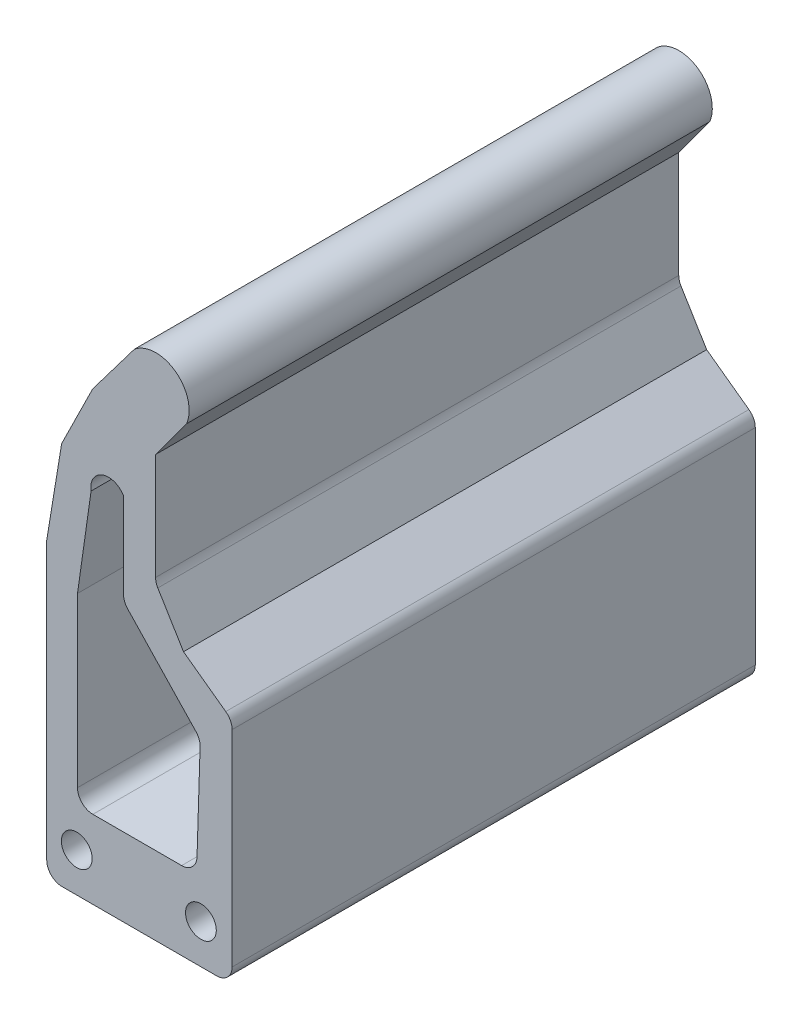
ISO-10303-21;
HEADER;
FILE_DESCRIPTION(('STEP AP214'),'2;1');
FILE_NAME('part.step','',(''),(''),'','','');
FILE_SCHEMA(('AUTOMOTIVE_DESIGN { 1 0 10303 214 1 1 1 1 }'));
ENDSEC;
DATA;
#1=APPLICATION_CONTEXT('core data for automotive mechanical design processes');
#2=APPLICATION_PROTOCOL_DEFINITION('international standard','automotive_design',2000,#1);
#3=PRODUCT_CONTEXT('',#1,'mechanical');
#4=PRODUCT('Part','Part','',(#3));
#5=PRODUCT_RELATED_PRODUCT_CATEGORY('part','',(#4));
#6=PRODUCT_DEFINITION_FORMATION('','',#4);
#7=PRODUCT_DEFINITION_CONTEXT('part definition',#1,'design');
#8=PRODUCT_DEFINITION('design','',#6,#7);
#9=PRODUCT_DEFINITION_SHAPE('','',#8);
#10=(LENGTH_UNIT() NAMED_UNIT(*) SI_UNIT(.MILLI.,.METRE.));
#11=(NAMED_UNIT(*) PLANE_ANGLE_UNIT() SI_UNIT($,.RADIAN.));
#12=(NAMED_UNIT(*) SI_UNIT($,.STERADIAN.) SOLID_ANGLE_UNIT());
#13=UNCERTAINTY_MEASURE_WITH_UNIT(LENGTH_MEASURE(1.E-05),#10,'distance_accuracy_value','');
#14=(GEOMETRIC_REPRESENTATION_CONTEXT(3) GLOBAL_UNCERTAINTY_ASSIGNED_CONTEXT((#13)) GLOBAL_UNIT_ASSIGNED_CONTEXT((#10,
#11,#12)) REPRESENTATION_CONTEXT('',''));
#15=CARTESIAN_POINT('',(0.,0.,0.));
#16=DIRECTION('',(0.,0.,1.));
#17=DIRECTION('',(1.,0.,0.));
#18=AXIS2_PLACEMENT_3D('',#15,#16,#17);
#19=CARTESIAN_POINT('',(-300.,367.,74.));
#20=DIRECTION('',(0.986834646515188,-0.161732434710062,0.));
#21=DIRECTION('',(0.161732434710062,0.986834646515188,0.));
#22=AXIS2_PLACEMENT_3D('',#19,#20,#21);
#23=PLANE('',#22);
#24=DIRECTION('',(-0.161732434710062,-0.986834646515188,0.));
#25=VECTOR('',#24,1.);
#26=CARTESIAN_POINT('',(-300.,367.,40.));
#27=LINE('',#26,#25);
#28=CARTESIAN_POINT('',(-299.02960539174,372.921007879091,40.));
#29=VERTEX_POINT('',#28);
#30=CARTESIAN_POINT('',(-300.,367.,40.));
#31=VERTEX_POINT('',#30);
#32=EDGE_CURVE('E287',#29,#31,#27,.T.);
#33=ORIENTED_EDGE('',*,*,#32,.T.);
#34=DIRECTION('',(0.,0.,-1.));
#35=VECTOR('',#34,1.);
#36=CARTESIAN_POINT('',(-300.,367.,74.));
#37=LINE('',#36,#35);
#38=CARTESIAN_POINT('',(-300.,367.,74.));
#39=VERTEX_POINT('',#38);
#40=EDGE_CURVE('E389',#39,#31,#37,.T.);
#41=ORIENTED_EDGE('',*,*,#40,.F.);
#42=DIRECTION('',(-0.161732434710062,-0.986834646515188,0.));
#43=VECTOR('',#42,1.);
#44=CARTESIAN_POINT('',(-300.,367.,74.));
#45=LINE('',#44,#43);
#46=CARTESIAN_POINT('',(-299.02960539174,372.921007879091,74.));
#47=VERTEX_POINT('',#46);
#48=EDGE_CURVE('E290',#47,#39,#45,.T.);
#49=ORIENTED_EDGE('',*,*,#48,.F.);
#50=DIRECTION('',(0.,0.,-1.));
#51=VECTOR('',#50,1.);
#52=CARTESIAN_POINT('',(-299.02960539174,372.921007879091,74.));
#53=LINE('',#52,#51);
#54=EDGE_CURVE('E329',#47,#29,#53,.T.);
#55=ORIENTED_EDGE('',*,*,#54,.T.);
#56=EDGE_LOOP('',(#33,#41,#49,#55));
#57=FACE_BOUND('',#56,.T.);
#58=ADVANCED_FACE('F39',(#57),#23,.F.);
#59=CARTESIAN_POINT('',(-300.,367.,74.));
#60=DIRECTION('',(1.,0.,0.));
#61=DIRECTION('',(0.,0.,-1.));
#62=AXIS2_PLACEMENT_3D('',#59,#60,#61);
#63=PLANE('',#62);
#64=DIRECTION('',(0.,-1.,0.));
#65=VECTOR('',#64,1.);
#66=CARTESIAN_POINT('',(-300.,367.,40.));
#67=LINE('',#66,#65);
#68=CARTESIAN_POINT('',(-300.,349.,40.));
#69=VERTEX_POINT('',#68);
#70=EDGE_CURVE('E333',#31,#69,#67,.T.);
#71=ORIENTED_EDGE('',*,*,#70,.T.);
#72=DIRECTION('',(0.,0.,-1.));
#73=VECTOR('',#72,1.);
#74=CARTESIAN_POINT('',(-300.,349.,74.));
#75=LINE('',#74,#73);
#76=CARTESIAN_POINT('',(-300.,349.,74.));
#77=VERTEX_POINT('',#76);
#78=EDGE_CURVE('E439',#69,#77,#75,.F.);
#79=ORIENTED_EDGE('',*,*,#78,.T.);
#80=DIRECTION('',(0.,-1.,0.));
#81=VECTOR('',#80,1.);
#82=CARTESIAN_POINT('',(-300.,367.,74.));
#83=LINE('',#82,#81);
#84=EDGE_CURVE('E294',#39,#77,#83,.T.);
#85=ORIENTED_EDGE('',*,*,#84,.F.);
#86=ORIENTED_EDGE('',*,*,#40,.T.);
#87=EDGE_LOOP('',(#71,#79,#85,#86));
#88=FACE_BOUND('',#87,.T.);
#89=ADVANCED_FACE('F530',(#88),#63,.F.);
#90=CARTESIAN_POINT('',(-300.,348.,74.));
#91=DIRECTION('',(0.,1.,0.));
#92=DIRECTION('',(0.,0.,1.));
#93=AXIS2_PLACEMENT_3D('',#90,#91,#92);
#94=PLANE('',#93);
#95=DIRECTION('',(1.,0.,0.));
#96=VECTOR('',#95,1.);
#97=CARTESIAN_POINT('',(-300.,348.,40.));
#98=LINE('',#97,#96);
#99=CARTESIAN_POINT('',(-299.,348.,40.));
#100=VERTEX_POINT('',#99);
#101=CARTESIAN_POINT('',(-288.951606439745,348.,40.));
#102=VERTEX_POINT('',#101);
#103=EDGE_CURVE('E337',#100,#102,#98,.T.);
#104=ORIENTED_EDGE('',*,*,#103,.T.);
#105=DIRECTION('',(0.,0.,-1.));
#106=VECTOR('',#105,1.);
#107=CARTESIAN_POINT('',(-288.951606439745,348.,74.));
#108=LINE('',#107,#106);
#109=CARTESIAN_POINT('',(-288.951606439745,348.,74.));
#110=VERTEX_POINT('',#109);
#111=EDGE_CURVE('E436',#102,#110,#108,.F.);
#112=ORIENTED_EDGE('',*,*,#111,.T.);
#113=DIRECTION('',(1.,0.,0.));
#114=VECTOR('',#113,1.);
#115=CARTESIAN_POINT('',(-300.,348.,74.));
#116=LINE('',#115,#114);
#117=CARTESIAN_POINT('',(-299.,348.,74.));
#118=VERTEX_POINT('',#117);
#119=EDGE_CURVE('E299',#118,#110,#116,.T.);
#120=ORIENTED_EDGE('',*,*,#119,.F.);
#121=DIRECTION('',(0.,0.,-1.));
#122=VECTOR('',#121,1.);
#123=CARTESIAN_POINT('',(-299.,348.,74.));
#124=LINE('',#123,#122);
#125=EDGE_CURVE('E432',#118,#100,#124,.T.);
#126=ORIENTED_EDGE('',*,*,#125,.T.);
#127=EDGE_LOOP('',(#104,#112,#120,#126));
#128=FACE_BOUND('',#127,.T.);
#129=ADVANCED_FACE('F536',(#128),#94,.F.);
#130=CARTESIAN_POINT('',(-287.951606439745,348.,74.));
#131=DIRECTION('',(-1.,0.,0.));
#132=DIRECTION('',(0.,0.,1.));
#133=AXIS2_PLACEMENT_3D('',#130,#131,#132);
#134=PLANE('',#133);
#135=DIRECTION('',(0.,1.,0.));
#136=VECTOR('',#135,1.);
#137=CARTESIAN_POINT('',(-287.951606439745,348.,40.));
#138=LINE('',#137,#136);
#139=CARTESIAN_POINT('',(-287.951606439745,349.,40.));
#140=VERTEX_POINT('',#139);
#141=CARTESIAN_POINT('',(-287.951606439745,362.362205386471,40.));
#142=VERTEX_POINT('',#141);
#143=EDGE_CURVE('E341',#140,#142,#138,.T.);
#144=ORIENTED_EDGE('',*,*,#143,.T.);
#145=DIRECTION('',(0.,0.,-1.));
#146=VECTOR('',#145,1.);
#147=CARTESIAN_POINT('',(-287.951606439745,362.362205386471,74.));
#148=LINE('',#147,#146);
#149=CARTESIAN_POINT('',(-287.951606439745,362.362205386471,74.));
#150=VERTEX_POINT('',#149);
#151=EDGE_CURVE('E417',#142,#150,#148,.F.);
#152=ORIENTED_EDGE('',*,*,#151,.T.);
#153=DIRECTION('',(0.,1.,0.));
#154=VECTOR('',#153,1.);
#155=CARTESIAN_POINT('',(-287.951606439745,348.,74.));
#156=LINE('',#155,#154);
#157=CARTESIAN_POINT('',(-287.951606439745,349.,74.));
#158=VERTEX_POINT('',#157);
#159=EDGE_CURVE('E303',#158,#150,#156,.T.);
#160=ORIENTED_EDGE('',*,*,#159,.F.);
#161=DIRECTION('',(0.,0.,-1.));
#162=VECTOR('',#161,1.);
#163=CARTESIAN_POINT('',(-287.951606439745,349.,74.));
#164=LINE('',#163,#162);
#165=EDGE_CURVE('E413',#158,#140,#164,.T.);
#166=ORIENTED_EDGE('',*,*,#165,.T.);
#167=EDGE_LOOP('',(#144,#152,#160,#166));
#168=FACE_BOUND('',#167,.T.);
#169=ADVANCED_FACE('F773',(#168),#134,.F.);
#170=CARTESIAN_POINT('',(-287.951606439745,362.871836257271,74.));
#171=DIRECTION('',(-0.587649831397212,-0.809115366099809,0.));
#172=DIRECTION('',(0.809115366099809,-0.587649831397212,0.));
#173=AXIS2_PLACEMENT_3D('',#170,#171,#172);
#174=PLANE('',#173);
#175=DIRECTION('',(-0.809115366099809,0.587649831397212,0.));
#176=VECTOR('',#175,1.);
#177=CARTESIAN_POINT('',(-287.951606439745,362.871836257271,74.));
#178=LINE('',#177,#176);
#179=CARTESIAN_POINT('',(-288.363956608348,363.171320752571,74.));
#180=VERTEX_POINT('',#179);
#181=CARTESIAN_POINT('',(-291.110931396484,365.166412353516,74.));
#182=VERTEX_POINT('',#181);
#183=EDGE_CURVE('E307',#180,#182,#178,.T.);
#184=ORIENTED_EDGE('',*,*,#183,.F.);
#185=DIRECTION('',(0.,0.,-1.));
#186=VECTOR('',#185,1.);
#187=CARTESIAN_POINT('',(-288.363956608348,363.171320752571,74.));
#188=LINE('',#187,#186);
#189=CARTESIAN_POINT('',(-288.363956608348,363.171320752571,40.));
#190=VERTEX_POINT('',#189);
#191=EDGE_CURVE('E400',#180,#190,#188,.T.);
#192=ORIENTED_EDGE('',*,*,#191,.T.);
#193=DIRECTION('',(-0.809115366099809,0.587649831397212,0.));
#194=VECTOR('',#193,1.);
#195=CARTESIAN_POINT('',(-287.951606439745,362.871836257271,40.));
#196=LINE('',#195,#194);
#197=CARTESIAN_POINT('',(-291.110931396484,365.166412353516,40.));
#198=VERTEX_POINT('',#197);
#199=EDGE_CURVE('E345',#190,#198,#196,.T.);
#200=ORIENTED_EDGE('',*,*,#199,.T.);
#201=DIRECTION('',(0.,0.,-1.));
#202=VECTOR('',#201,1.);
#203=CARTESIAN_POINT('',(-291.110931396484,365.166412353516,74.));
#204=LINE('',#203,#202);
#205=EDGE_CURVE('E385',#182,#198,#204,.T.);
#206=ORIENTED_EDGE('',*,*,#205,.F.);
#207=EDGE_LOOP('',(#184,#192,#200,#206));
#208=FACE_BOUND('',#207,.T.);
#209=ADVANCED_FACE('F764',(#208),#174,.F.);
#210=CARTESIAN_POINT('',(-291.110931396484,365.166412353516,74.));
#211=DIRECTION('',(-0.855055239305162,-0.518536920321776,0.));
#212=DIRECTION('',(0.518536920321776,-0.855055239305162,0.));
#213=AXIS2_PLACEMENT_3D('',#210,#211,#212);
#214=PLANE('',#213);
#215=DIRECTION('',(-0.518536920321776,0.855055239305162,0.));
#216=VECTOR('',#215,1.);
#217=CARTESIAN_POINT('',(-291.110931396484,365.166412353516,40.));
#218=LINE('',#217,#216);
#219=CARTESIAN_POINT('',(-292.780865856916,367.920095174793,40.));
#220=VERTEX_POINT('',#219);
#221=EDGE_CURVE('E348',#198,#220,#218,.T.);
#222=ORIENTED_EDGE('',*,*,#221,.T.);
#223=DIRECTION('',(0.,0.,-1.));
#224=VECTOR('',#223,1.);
#225=CARTESIAN_POINT('',(-292.780865856916,367.920095174793,74.));
#226=LINE('',#225,#224);
#227=CARTESIAN_POINT('',(-292.780865856916,367.920095174793,74.));
#228=VERTEX_POINT('',#227);
#229=EDGE_CURVE('E397',#220,#228,#226,.F.);
#230=ORIENTED_EDGE('',*,*,#229,.T.);
#231=DIRECTION('',(-0.518536920321776,0.855055239305162,0.));
#232=VECTOR('',#231,1.);
#233=CARTESIAN_POINT('',(-291.110931396484,365.166412353516,74.));
#234=LINE('',#233,#232);
#235=EDGE_CURVE('E310',#182,#228,#234,.T.);
#236=ORIENTED_EDGE('',*,*,#235,.F.);
#237=ORIENTED_EDGE('',*,*,#205,.T.);
#238=EDGE_LOOP('',(#222,#230,#236,#237));
#239=FACE_BOUND('',#238,.T.);
#240=ADVANCED_FACE('F755',(#239),#214,.F.);
#241=CARTESIAN_POINT('',(-292.925810617611,368.159105691084,74.));
#242=DIRECTION('',(-1.,0.,0.));
#243=DIRECTION('',(0.,0.,1.));
#244=AXIS2_PLACEMENT_3D('',#241,#242,#243);
#245=PLANE('',#244);
#246=DIRECTION('',(0.,1.,0.));
#247=VECTOR('',#246,1.);
#248=CARTESIAN_POINT('',(-292.925810617611,368.159105691084,74.));
#249=LINE('',#248,#247);
#250=CARTESIAN_POINT('',(-292.925810617611,368.438632095115,74.));
#251=VERTEX_POINT('',#250);
#252=CARTESIAN_POINT('',(-292.925810617611,375.359105691084,74.));
#253=VERTEX_POINT('',#252);
#254=EDGE_CURVE('E314',#251,#253,#249,.T.);
#255=ORIENTED_EDGE('',*,*,#254,.F.);
#256=DIRECTION('',(0.,0.,-1.));
#257=VECTOR('',#256,1.);
#258=CARTESIAN_POINT('',(-292.925810617611,368.438632095115,40.));
#259=LINE('',#258,#257);
#260=CARTESIAN_POINT('',(-292.925810617611,368.438632095115,40.));
#261=VERTEX_POINT('',#260);
#262=EDGE_CURVE('E393',#251,#261,#259,.T.);
#263=ORIENTED_EDGE('',*,*,#262,.T.);
#264=DIRECTION('',(0.,1.,0.));
#265=VECTOR('',#264,1.);
#266=CARTESIAN_POINT('',(-292.925810617611,368.159105691084,40.));
#267=LINE('',#266,#265);
#268=CARTESIAN_POINT('',(-292.925810617611,375.359105691084,40.));
#269=VERTEX_POINT('',#268);
#270=EDGE_CURVE('E352',#261,#269,#267,.T.);
#271=ORIENTED_EDGE('',*,*,#270,.T.);
#272=DIRECTION('',(0.,0.,-1.));
#273=VECTOR('',#272,1.);
#274=CARTESIAN_POINT('',(-292.925810617611,375.359105691084,74.));
#275=LINE('',#274,#273);
#276=EDGE_CURVE('E381',#253,#269,#275,.T.);
#277=ORIENTED_EDGE('',*,*,#276,.F.);
#278=EDGE_LOOP('',(#255,#263,#271,#277));
#279=FACE_BOUND('',#278,.T.);
#280=ADVANCED_FACE('F747',(#279),#245,.F.);
#281=CARTESIAN_POINT('',(-292.925810617611,375.359105691084,74.));
#282=DIRECTION('',(-0.805397111157276,0.592735601545507,0.));
#283=DIRECTION('',(-0.592735601545507,-0.805397111157276,0.));
#284=AXIS2_PLACEMENT_3D('',#281,#282,#283);
#285=PLANE('',#284);
#286=DIRECTION('',(0.592735601545507,0.805397111157276,0.));
#287=VECTOR('',#286,1.);
#288=CARTESIAN_POINT('',(-292.925810617611,375.359105691084,40.));
#289=LINE('',#288,#287);
#290=CARTESIAN_POINT('',(-290.910509572356,378.097455869018,40.));
#291=VERTEX_POINT('',#290);
#292=EDGE_CURVE('E355',#269,#291,#289,.T.);
#293=ORIENTED_EDGE('',*,*,#292,.T.);
#294=DIRECTION('',(0.,0.,-1.));
#295=VECTOR('',#294,1.);
#296=CARTESIAN_POINT('',(-290.910509572356,378.097455869018,74.));
#297=LINE('',#296,#295);
#298=CARTESIAN_POINT('',(-290.910509572356,378.097455869018,74.));
#299=VERTEX_POINT('',#298);
#300=EDGE_CURVE('E377',#299,#291,#297,.T.);
#301=ORIENTED_EDGE('',*,*,#300,.F.);
#302=DIRECTION('',(0.592735601545507,0.805397111157276,0.));
#303=VECTOR('',#302,1.);
#304=CARTESIAN_POINT('',(-292.925810617611,375.359105691084,74.));
#305=LINE('',#304,#303);
#306=EDGE_CURVE('E317',#253,#299,#305,.T.);
#307=ORIENTED_EDGE('',*,*,#306,.F.);
#308=ORIENTED_EDGE('',*,*,#276,.T.);
#309=EDGE_LOOP('',(#293,#301,#307,#308));
#310=FACE_BOUND('',#309,.T.);
#311=ADVANCED_FACE('F738',(#310),#285,.F.);
#312=CARTESIAN_POINT('',(-292.914695624546,378.929613057887,74.));
#313=DIRECTION('',(0.,0.,-1.));
#314=DIRECTION('',(-1.,0.,0.));
#315=AXIS2_PLACEMENT_3D('',#312,#313,#314);
#316=CYLINDRICAL_SURFACE('',#315,2.17008002589271);
#317=CARTESIAN_POINT('',(-292.914695624546,378.929613057887,40.));
#318=DIRECTION('',(0.,0.,1.));
#319=DIRECTION('',(-1.,0.,0.));
#320=AXIS2_PLACEMENT_3D('',#317,#318,#319);
#321=CIRCLE('',#320,2.17008002589271);
#322=CARTESIAN_POINT('',(-294.299987792969,380.600006103516,40.));
#323=VERTEX_POINT('',#322);
#324=EDGE_CURVE('E358',#291,#323,#321,.T.);
#325=ORIENTED_EDGE('',*,*,#324,.T.);
#326=DIRECTION('',(0.,0.,-1.));
#327=VECTOR('',#326,1.);
#328=CARTESIAN_POINT('',(-294.299987792969,380.600006103516,74.));
#329=LINE('',#328,#327);
#330=CARTESIAN_POINT('',(-294.299987792969,380.600006103516,74.));
#331=VERTEX_POINT('',#330);
#332=EDGE_CURVE('E373',#331,#323,#329,.T.);
#333=ORIENTED_EDGE('',*,*,#332,.F.);
#334=CARTESIAN_POINT('',(-292.914695624546,378.929613057887,74.));
#335=DIRECTION('',(0.,0.,1.));
#336=DIRECTION('',(-1.,0.,0.));
#337=AXIS2_PLACEMENT_3D('',#334,#335,#336);
#338=CIRCLE('',#337,2.17008002589271);
#339=EDGE_CURVE('E320',#299,#331,#338,.T.);
#340=ORIENTED_EDGE('',*,*,#339,.F.);
#341=ORIENTED_EDGE('',*,*,#300,.T.);
#342=EDGE_LOOP('',(#325,#333,#340,#341));
#343=FACE_BOUND('',#342,.T.);
#344=ADVANCED_FACE('F729',(#343),#316,.T.);
#345=CARTESIAN_POINT('',(-297.012375964007,377.009330622549,74.));
#346=DIRECTION('',(0.797927884659181,-0.602752926897352,0.));
#347=DIRECTION('',(0.602752926897352,0.797927884659181,0.));
#348=AXIS2_PLACEMENT_3D('',#345,#346,#347);
#349=PLANE('',#348);
#350=DIRECTION('',(-0.602752926897352,-0.797927884659181,0.));
#351=VECTOR('',#350,1.);
#352=CARTESIAN_POINT('',(-297.012375964007,377.009330622549,40.));
#353=LINE('',#352,#351);
#354=CARTESIAN_POINT('',(-297.012375964007,377.009330622549,40.));
#355=VERTEX_POINT('',#354);
#356=EDGE_CURVE('E361',#323,#355,#353,.T.);
#357=ORIENTED_EDGE('',*,*,#356,.T.);
#358=DIRECTION('',(0.,0.,-1.));
#359=VECTOR('',#358,1.);
#360=CARTESIAN_POINT('',(-297.012375964007,377.009330622549,74.));
#361=LINE('',#360,#359);
#362=CARTESIAN_POINT('',(-297.012375964007,377.009330622549,74.));
#363=VERTEX_POINT('',#362);
#364=EDGE_CURVE('E369',#363,#355,#361,.T.);
#365=ORIENTED_EDGE('',*,*,#364,.F.);
#366=DIRECTION('',(-0.602752926897352,-0.797927884659181,0.));
#367=VECTOR('',#366,1.);
#368=CARTESIAN_POINT('',(-297.012375964007,377.009330622549,74.));
#369=LINE('',#368,#367);
#370=EDGE_CURVE('E323',#331,#363,#369,.T.);
#371=ORIENTED_EDGE('',*,*,#370,.F.);
#372=ORIENTED_EDGE('',*,*,#332,.T.);
#373=EDGE_LOOP('',(#357,#365,#371,#372));
#374=FACE_BOUND('',#373,.T.);
#375=ADVANCED_FACE('F720',(#374),#349,.F.);
#376=CARTESIAN_POINT('',(-299.02960539174,372.921007879091,74.));
#377=DIRECTION('',(0.896777724669226,-0.442481313206655,0.));
#378=DIRECTION('',(0.442481313206655,0.896777724669226,0.));
#379=AXIS2_PLACEMENT_3D('',#376,#377,#378);
#380=PLANE('',#379);
#381=DIRECTION('',(-0.442481313206655,-0.896777724669226,0.));
#382=VECTOR('',#381,1.);
#383=CARTESIAN_POINT('',(-299.02960539174,372.921007879091,40.));
#384=LINE('',#383,#382);
#385=EDGE_CURVE('E295',#355,#29,#384,.T.);
#386=ORIENTED_EDGE('',*,*,#385,.T.);
#387=ORIENTED_EDGE('',*,*,#54,.F.);
#388=DIRECTION('',(-0.442481313206655,-0.896777724669226,0.));
#389=VECTOR('',#388,1.);
#390=CARTESIAN_POINT('',(-299.02960539174,372.921007879091,74.));
#391=LINE('',#390,#389);
#392=EDGE_CURVE('E326',#363,#47,#391,.T.);
#393=ORIENTED_EDGE('',*,*,#392,.F.);
#394=ORIENTED_EDGE('',*,*,#364,.T.);
#395=EDGE_LOOP('',(#386,#387,#393,#394));
#396=FACE_BOUND('',#395,.T.);
#397=ADVANCED_FACE('F711',(#396),#380,.F.);
#398=CARTESIAN_POINT('',(-292.914695624546,378.929613057887,74.));
#399=DIRECTION('',(0.,0.,-1.));
#400=DIRECTION('',(-1.,0.,0.));
#401=AXIS2_PLACEMENT_3D('',#398,#399,#400);
#402=PLANE('',#401);
#403=CARTESIAN_POINT('',(-298.046417961778,350.54605621625,74.));
#404=DIRECTION('',(0.,0.,1.));
#405=DIRECTION('',(1.,0.,0.));
#406=AXIS2_PLACEMENT_3D('',#403,#404,#405);
#407=CIRCLE('',#406,0.999999999999998);
#408=CARTESIAN_POINT('',(-297.046417961778,350.54605621625,74.));
#409=VERTEX_POINT('',#408);
#410=EDGE_CURVE('E869',#409,#409,#407,.T.);
#411=ORIENTED_EDGE('',*,*,#410,.F.);
#412=EDGE_LOOP('',(#411));
#413=FACE_BOUND('',#412,.T.);
#414=CARTESIAN_POINT('',(-289.979523898029,350.54605621625,74.));
#415=DIRECTION('',(0.,0.,1.));
#416=DIRECTION('',(1.,0.,0.));
#417=AXIS2_PLACEMENT_3D('',#414,#415,#416);
#418=CIRCLE('',#417,0.999999999999998);
#419=CARTESIAN_POINT('',(-288.979523898029,350.54605621625,74.));
#420=VERTEX_POINT('',#419);
#421=EDGE_CURVE('E248',#420,#420,#418,.T.);
#422=ORIENTED_EDGE('',*,*,#421,.F.);
#423=EDGE_LOOP('',(#422));
#424=FACE_BOUND('',#423,.T.);
#425=DIRECTION('',(0.,1.,0.));
#426=VECTOR('',#425,1.);
#427=CARTESIAN_POINT('',(-295.010009765625,366.046598155361,74.));
#428=LINE('',#427,#426);
#429=CARTESIAN_POINT('',(-295.010009765625,366.445117957466,74.));
#430=VERTEX_POINT('',#429);
#431=CARTESIAN_POINT('',(-295.010009765625,371.995180702691,74.));
#432=VERTEX_POINT('',#431);
#433=EDGE_CURVE('E242',#430,#432,#428,.T.);
#434=ORIENTED_EDGE('',*,*,#433,.F.);
#435=CARTESIAN_POINT('',(-294.010009765625,366.445117957466,74.));
#436=DIRECTION('',(0.,0.,-1.));
#437=DIRECTION('',(-1.,0.,0.));
#438=AXIS2_PLACEMENT_3D('',#435,#436,#437);
#439=CIRCLE('',#438,1.);
#440=CARTESIAN_POINT('',(-294.735906277084,365.757314021266,74.));
#441=VERTEX_POINT('',#440);
#442=EDGE_CURVE('E420',#430,#441,#439,.F.);
#443=ORIENTED_EDGE('',*,*,#442,.T.);
#444=DIRECTION('',(-0.687803936199452,0.725896511459134,0.));
#445=VECTOR('',#444,1.);
#446=CARTESIAN_POINT('',(-290.018829345703,360.778991699219,74.));
#447=LINE('',#446,#445);
#448=CARTESIAN_POINT('',(-290.305656331398,361.081703994614,74.));
#449=VERTEX_POINT('',#448);
#450=EDGE_CURVE('E245',#449,#441,#447,.T.);
#451=ORIENTED_EDGE('',*,*,#450,.F.);
#452=CARTESIAN_POINT('',(-291.031552842858,360.393900058414,74.));
#453=DIRECTION('',(0.,0.,-1.));
#454=DIRECTION('',(-1.,0.,0.));
#455=AXIS2_PLACEMENT_3D('',#452,#453,#454);
#456=CIRCLE('',#455,1.);
#457=CARTESIAN_POINT('',(-290.032055956022,360.362182977758,74.));
#458=VERTEX_POINT('',#457);
#459=EDGE_CURVE('E484',#449,#458,#456,.T.);
#460=ORIENTED_EDGE('',*,*,#459,.T.);
#461=DIRECTION('',(0.0317170806563282,0.999496886835892,0.));
#462=VECTOR('',#461,1.);
#463=CARTESIAN_POINT('',(-290.263445910318,353.07041670614,74.));
#464=LINE('',#463,#462);
#465=CARTESIAN_POINT('',(-290.232719343927,354.038699625483,74.));
#466=VERTEX_POINT('',#465);
#467=EDGE_CURVE('E277',#466,#458,#464,.T.);
#468=ORIENTED_EDGE('',*,*,#467,.F.);
#469=CARTESIAN_POINT('',(-291.232216230763,354.07041670614,74.));
#470=DIRECTION('',(0.,0.,-1.));
#471=DIRECTION('',(-1.,0.,0.));
#472=AXIS2_PLACEMENT_3D('',#469,#470,#471);
#473=CIRCLE('',#472,1.);
#474=CARTESIAN_POINT('',(-291.232216230763,353.07041670614,74.));
#475=VERTEX_POINT('',#474);
#476=EDGE_CURVE('E48',#466,#475,#473,.T.);
#477=ORIENTED_EDGE('',*,*,#476,.T.);
#478=DIRECTION('',(1.,0.,0.));
#479=VECTOR('',#478,1.);
#480=CARTESIAN_POINT('',(-298.,353.07041670614,74.));
#481=LINE('',#480,#479);
#482=CARTESIAN_POINT('',(-297.,353.07041670614,74.));
#483=VERTEX_POINT('',#482);
#484=EDGE_CURVE('E274',#483,#475,#481,.T.);
#485=ORIENTED_EDGE('',*,*,#484,.F.);
#486=CARTESIAN_POINT('',(-297.,354.07041670614,74.));
#487=DIRECTION('',(0.,0.,-1.));
#488=DIRECTION('',(-1.,0.,0.));
#489=AXIS2_PLACEMENT_3D('',#486,#487,#488);
#490=CIRCLE('',#489,1.);
#491=CARTESIAN_POINT('',(-298.,354.07041670614,74.));
#492=VERTEX_POINT('',#491);
#493=EDGE_CURVE('E11',#483,#492,#490,.T.);
#494=ORIENTED_EDGE('',*,*,#493,.T.);
#495=DIRECTION('',(0.,-1.,0.));
#496=VECTOR('',#495,1.);
#497=CARTESIAN_POINT('',(-298.,365.,74.));
#498=LINE('',#497,#496);
#499=CARTESIAN_POINT('',(-298.,365.,74.));
#500=VERTEX_POINT('',#499);
#501=EDGE_CURVE('E270',#500,#492,#498,.T.);
#502=ORIENTED_EDGE('',*,*,#501,.F.);
#503=DIRECTION('',(-0.140886164265566,-0.990025802046864,0.));
#504=VECTOR('',#503,1.);
#505=CARTESIAN_POINT('',(-297.116612997975,371.207677877785,74.));
#506=LINE('',#505,#504);
#507=CARTESIAN_POINT('',(-297.116612997975,371.207677877785,74.));
#508=VERTEX_POINT('',#507);
#509=EDGE_CURVE('E266',#508,#500,#506,.T.);
#510=ORIENTED_EDGE('',*,*,#509,.F.);
#511=CARTESIAN_POINT('',(-295.991386116136,371.409026174535,74.));
#512=DIRECTION('',(0.,0.,1.));
#513=DIRECTION('',(-1.,0.,0.));
#514=AXIS2_PLACEMENT_3D('',#511,#512,#513);
#515=CIRCLE('',#514,1.14309958980794);
#516=EDGE_CURVE('E222',#432,#508,#515,.T.);
#517=ORIENTED_EDGE('',*,*,#516,.F.);
#518=EDGE_LOOP('',(#434,#443,#451,#460,#468,#477,#485,#494,#502,#510,#517));
#519=FACE_BOUND('',#518,.T.);
#520=ORIENTED_EDGE('',*,*,#159,.T.);
#521=CARTESIAN_POINT('',(-288.951606439745,362.362205386471,74.));
#522=DIRECTION('',(0.,0.,-1.));
#523=DIRECTION('',(-1.,0.,0.));
#524=AXIS2_PLACEMENT_3D('',#521,#522,#523);
#525=CIRCLE('',#524,1.);
#526=EDGE_CURVE('E429',#150,#180,#525,.F.);
#527=ORIENTED_EDGE('',*,*,#526,.T.);
#528=ORIENTED_EDGE('',*,*,#183,.T.);
#529=ORIENTED_EDGE('',*,*,#235,.T.);
#530=CARTESIAN_POINT('',(-291.925810617611,368.438632095115,74.));
#531=DIRECTION('',(0.,0.,-1.));
#532=DIRECTION('',(-1.,0.,0.));
#533=AXIS2_PLACEMENT_3D('',#530,#531,#532);
#534=CIRCLE('',#533,1.);
#535=EDGE_CURVE('E481',#228,#251,#534,.T.);
#536=ORIENTED_EDGE('',*,*,#535,.T.);
#537=ORIENTED_EDGE('',*,*,#254,.T.);
#538=ORIENTED_EDGE('',*,*,#306,.T.);
#539=ORIENTED_EDGE('',*,*,#339,.T.);
#540=ORIENTED_EDGE('',*,*,#370,.T.);
#541=ORIENTED_EDGE('',*,*,#392,.T.);
#542=ORIENTED_EDGE('',*,*,#48,.T.);
#543=ORIENTED_EDGE('',*,*,#84,.T.);
#544=CARTESIAN_POINT('',(-299.,349.,74.));
#545=DIRECTION('',(0.,0.,-1.));
#546=DIRECTION('',(-1.,0.,0.));
#547=AXIS2_PLACEMENT_3D('',#544,#545,#546);
#548=CIRCLE('',#547,1.);
#549=EDGE_CURVE('E423',#77,#118,#548,.F.);
#550=ORIENTED_EDGE('',*,*,#549,.T.);
#551=ORIENTED_EDGE('',*,*,#119,.T.);
#552=CARTESIAN_POINT('',(-288.951606439745,349.,74.));
#553=DIRECTION('',(0.,0.,-1.));
#554=DIRECTION('',(-1.,0.,0.));
#555=AXIS2_PLACEMENT_3D('',#552,#553,#554);
#556=CIRCLE('',#555,1.);
#557=EDGE_CURVE('E426',#110,#158,#556,.F.);
#558=ORIENTED_EDGE('',*,*,#557,.T.);
#559=EDGE_LOOP('',(#520,#527,#528,#529,#536,#537,#538,#539,#540,#541,#542,#543,#550,#551,#558));
#560=FACE_BOUND('',#559,.T.);
#561=ADVANCED_FACE('F493',(#413,#424,#519,#560),#402,.F.);
#562=CARTESIAN_POINT('',(-292.914695624546,378.929613057887,40.));
#563=DIRECTION('',(0.,0.,-1.));
#564=DIRECTION('',(-1.,0.,0.));
#565=AXIS2_PLACEMENT_3D('',#562,#563,#564);
#566=PLANE('',#565);
#567=ORIENTED_EDGE('',*,*,#199,.F.);
#568=CARTESIAN_POINT('',(-288.951606439745,362.362205386471,40.));
#569=DIRECTION('',(0.,0.,-1.));
#570=DIRECTION('',(-1.,0.,0.));
#571=AXIS2_PLACEMENT_3D('',#568,#569,#570);
#572=CIRCLE('',#571,1.);
#573=EDGE_CURVE('E410',#190,#142,#572,.T.);
#574=ORIENTED_EDGE('',*,*,#573,.T.);
#575=ORIENTED_EDGE('',*,*,#143,.F.);
#576=CARTESIAN_POINT('',(-288.951606439745,349.,40.));
#577=DIRECTION('',(0.,0.,-1.));
#578=DIRECTION('',(-1.,0.,0.));
#579=AXIS2_PLACEMENT_3D('',#576,#577,#578);
#580=CIRCLE('',#579,1.);
#581=EDGE_CURVE('E407',#140,#102,#580,.T.);
#582=ORIENTED_EDGE('',*,*,#581,.T.);
#583=ORIENTED_EDGE('',*,*,#103,.F.);
#584=CARTESIAN_POINT('',(-299.,349.,40.));
#585=DIRECTION('',(0.,0.,-1.));
#586=DIRECTION('',(-1.,0.,0.));
#587=AXIS2_PLACEMENT_3D('',#584,#585,#586);
#588=CIRCLE('',#587,1.);
#589=EDGE_CURVE('E404',#100,#69,#588,.T.);
#590=ORIENTED_EDGE('',*,*,#589,.T.);
#591=ORIENTED_EDGE('',*,*,#70,.F.);
#592=ORIENTED_EDGE('',*,*,#32,.F.);
#593=ORIENTED_EDGE('',*,*,#385,.F.);
#594=ORIENTED_EDGE('',*,*,#356,.F.);
#595=ORIENTED_EDGE('',*,*,#324,.F.);
#596=ORIENTED_EDGE('',*,*,#292,.F.);
#597=ORIENTED_EDGE('',*,*,#270,.F.);
#598=CARTESIAN_POINT('',(-291.925810617611,368.438632095115,40.));
#599=DIRECTION('',(0.,0.,-1.));
#600=DIRECTION('',(-1.,0.,0.));
#601=AXIS2_PLACEMENT_3D('',#598,#599,#600);
#602=CIRCLE('',#601,1.);
#603=EDGE_CURVE('E478',#261,#220,#602,.F.);
#604=ORIENTED_EDGE('',*,*,#603,.T.);
#605=ORIENTED_EDGE('',*,*,#221,.F.);
#606=EDGE_LOOP('',(#567,#574,#575,#582,#583,#590,#591,#592,#593,#594,#595,#596,#597,#604,#605));
#607=FACE_BOUND('',#606,.T.);
#608=ADVANCED_FACE('F695',(#607),#566,.T.);
#609=CARTESIAN_POINT('',(-295.991386116136,371.409026174535,42.));
#610=DIRECTION('',(0.,0.,1.));
#611=DIRECTION('',(1.,0.,0.));
#612=AXIS2_PLACEMENT_3D('',#609,#610,#611);
#613=CYLINDRICAL_SURFACE('',#612,1.14309958980794);
#614=ORIENTED_EDGE('',*,*,#516,.T.);
#615=DIRECTION('',(0.,0.,1.));
#616=VECTOR('',#615,1.);
#617=CARTESIAN_POINT('',(-297.116612997975,371.207677877785,42.));
#618=LINE('',#617,#616);
#619=CARTESIAN_POINT('',(-297.116612997975,371.207677877785,42.));
#620=VERTEX_POINT('',#619);
#621=EDGE_CURVE('E215',#620,#508,#618,.T.);
#622=ORIENTED_EDGE('',*,*,#621,.F.);
#623=CARTESIAN_POINT('',(-295.991386116136,371.409026174535,42.));
#624=DIRECTION('',(0.,0.,1.));
#625=DIRECTION('',(-1.,0.,0.));
#626=AXIS2_PLACEMENT_3D('',#623,#624,#625);
#627=CIRCLE('',#626,1.14309958980794);
#628=CARTESIAN_POINT('',(-295.010009765625,371.995180702691,42.));
#629=VERTEX_POINT('',#628);
#630=EDGE_CURVE('E220',#629,#620,#627,.T.);
#631=ORIENTED_EDGE('',*,*,#630,.F.);
#632=DIRECTION('',(0.,0.,1.));
#633=VECTOR('',#632,1.);
#634=CARTESIAN_POINT('',(-295.010009765625,371.995180702691,42.));
#635=LINE('',#634,#633);
#636=EDGE_CURVE('E284',#629,#432,#635,.T.);
#637=ORIENTED_EDGE('',*,*,#636,.T.);
#638=EDGE_LOOP('',(#614,#622,#631,#637));
#639=FACE_BOUND('',#638,.T.);
#640=ADVANCED_FACE('F217',(#639),#613,.F.);
#641=CARTESIAN_POINT('',(-295.010009765625,366.046598155361,42.));
#642=DIRECTION('',(1.,0.,0.));
#643=DIRECTION('',(0.,0.,-1.));
#644=AXIS2_PLACEMENT_3D('',#641,#642,#643);
#645=PLANE('',#644);
#646=DIRECTION('',(0.,1.,0.));
#647=VECTOR('',#646,1.);
#648=CARTESIAN_POINT('',(-295.010009765625,366.046598155361,42.));
#649=LINE('',#648,#647);
#650=CARTESIAN_POINT('',(-295.010009765625,366.445117957466,42.));
#651=VERTEX_POINT('',#650);
#652=EDGE_CURVE('E228',#651,#629,#649,.T.);
#653=ORIENTED_EDGE('',*,*,#652,.F.);
#654=DIRECTION('',(0.,0.,1.));
#655=VECTOR('',#654,1.);
#656=CARTESIAN_POINT('',(-295.010009765625,366.445117957466,42.));
#657=LINE('',#656,#655);
#658=EDGE_CURVE('E465',#651,#430,#657,.T.);
#659=ORIENTED_EDGE('',*,*,#658,.T.);
#660=ORIENTED_EDGE('',*,*,#433,.T.);
#661=ORIENTED_EDGE('',*,*,#636,.F.);
#662=EDGE_LOOP('',(#653,#659,#660,#661));
#663=FACE_BOUND('',#662,.T.);
#664=ADVANCED_FACE('F518',(#663),#645,.F.);
#665=CARTESIAN_POINT('',(-290.018829345703,360.778991699219,42.));
#666=DIRECTION('',(0.725896511459134,0.687803936199452,0.));
#667=DIRECTION('',(-0.687803936199452,0.725896511459134,0.));
#668=AXIS2_PLACEMENT_3D('',#665,#666,#667);
#669=PLANE('',#668);
#670=DIRECTION('',(-0.687803936199452,0.725896511459134,0.));
#671=VECTOR('',#670,1.);
#672=CARTESIAN_POINT('',(-290.018829345703,360.778991699219,42.));
#673=LINE('',#672,#671);
#674=CARTESIAN_POINT('',(-290.305656331398,361.081703994614,42.));
#675=VERTEX_POINT('',#674);
#676=CARTESIAN_POINT('',(-294.735906277084,365.757314021266,42.));
#677=VERTEX_POINT('',#676);
#678=EDGE_CURVE('E259',#675,#677,#673,.T.);
#679=ORIENTED_EDGE('',*,*,#678,.F.);
#680=DIRECTION('',(0.,0.,1.));
#681=VECTOR('',#680,1.);
#682=CARTESIAN_POINT('',(-290.305656331398,361.081703994614,74.));
#683=LINE('',#682,#681);
#684=EDGE_CURVE('E445',#675,#449,#683,.T.);
#685=ORIENTED_EDGE('',*,*,#684,.T.);
#686=ORIENTED_EDGE('',*,*,#450,.T.);
#687=DIRECTION('',(0.,0.,1.));
#688=VECTOR('',#687,1.);
#689=CARTESIAN_POINT('',(-294.735906277084,365.757314021266,42.));
#690=LINE('',#689,#688);
#691=EDGE_CURVE('E442',#441,#677,#690,.F.);
#692=ORIENTED_EDGE('',*,*,#691,.T.);
#693=EDGE_LOOP('',(#679,#685,#686,#692));
#694=FACE_BOUND('',#693,.T.);
#695=ADVANCED_FACE('F511',(#694),#669,.F.);
#696=CARTESIAN_POINT('',(-290.263445910318,353.07041670614,42.));
#697=DIRECTION('',(0.999496886835892,-0.0317170806563282,0.));
#698=DIRECTION('',(0.0317170806563282,0.999496886835892,0.));
#699=AXIS2_PLACEMENT_3D('',#696,#697,#698);
#700=PLANE('',#699);
#701=ORIENTED_EDGE('',*,*,#467,.T.);
#702=DIRECTION('',(0.,0.,1.));
#703=VECTOR('',#702,1.);
#704=CARTESIAN_POINT('',(-290.032055956022,360.362182977758,42.));
#705=LINE('',#704,#703);
#706=CARTESIAN_POINT('',(-290.032055956022,360.362182977758,42.));
#707=VERTEX_POINT('',#706);
#708=EDGE_CURVE('E453',#458,#707,#705,.F.);
#709=ORIENTED_EDGE('',*,*,#708,.T.);
#710=DIRECTION('',(0.0317170806563282,0.999496886835892,0.));
#711=VECTOR('',#710,1.);
#712=CARTESIAN_POINT('',(-290.263445910318,353.07041670614,42.));
#713=LINE('',#712,#711);
#714=CARTESIAN_POINT('',(-290.232719343927,354.038699625483,42.));
#715=VERTEX_POINT('',#714);
#716=EDGE_CURVE('E256',#715,#707,#713,.T.);
#717=ORIENTED_EDGE('',*,*,#716,.F.);
#718=DIRECTION('',(0.,0.,1.));
#719=VECTOR('',#718,1.);
#720=CARTESIAN_POINT('',(-290.232719343927,354.038699625483,74.));
#721=LINE('',#720,#719);
#722=EDGE_CURVE('E449',#715,#466,#721,.T.);
#723=ORIENTED_EDGE('',*,*,#722,.T.);
#724=EDGE_LOOP('',(#701,#709,#717,#723));
#725=FACE_BOUND('',#724,.T.);
#726=ADVANCED_FACE('F504',(#725),#700,.F.);
#727=CARTESIAN_POINT('',(-298.,353.07041670614,42.));
#728=DIRECTION('',(0.,-1.,0.));
#729=DIRECTION('',(0.,0.,-1.));
#730=AXIS2_PLACEMENT_3D('',#727,#728,#729);
#731=PLANE('',#730);
#732=ORIENTED_EDGE('',*,*,#484,.T.);
#733=DIRECTION('',(0.,0.,1.));
#734=VECTOR('',#733,1.);
#735=CARTESIAN_POINT('',(-291.232216230763,353.07041670614,42.));
#736=LINE('',#735,#734);
#737=CARTESIAN_POINT('',(-291.232216230763,353.07041670614,42.));
#738=VERTEX_POINT('',#737);
#739=EDGE_CURVE('E63',#475,#738,#736,.F.);
#740=ORIENTED_EDGE('',*,*,#739,.T.);
#741=DIRECTION('',(1.,0.,0.));
#742=VECTOR('',#741,1.);
#743=CARTESIAN_POINT('',(-298.,353.07041670614,42.));
#744=LINE('',#743,#742);
#745=CARTESIAN_POINT('',(-297.,353.07041670614,42.));
#746=VERTEX_POINT('',#745);
#747=EDGE_CURVE('E253',#746,#738,#744,.T.);
#748=ORIENTED_EDGE('',*,*,#747,.F.);
#749=DIRECTION('',(0.,0.,1.));
#750=VECTOR('',#749,1.);
#751=CARTESIAN_POINT('',(-297.,353.07041670614,74.));
#752=LINE('',#751,#750);
#753=EDGE_CURVE('E469',#746,#483,#752,.T.);
#754=ORIENTED_EDGE('',*,*,#753,.T.);
#755=EDGE_LOOP('',(#732,#740,#748,#754));
#756=FACE_BOUND('',#755,.T.);
#757=ADVANCED_FACE('F497',(#756),#731,.F.);
#758=CARTESIAN_POINT('',(-298.,365.,42.));
#759=DIRECTION('',(-1.,0.,0.));
#760=DIRECTION('',(0.,0.,1.));
#761=AXIS2_PLACEMENT_3D('',#758,#759,#760);
#762=PLANE('',#761);
#763=ORIENTED_EDGE('',*,*,#501,.T.);
#764=DIRECTION('',(0.,0.,1.));
#765=VECTOR('',#764,1.);
#766=CARTESIAN_POINT('',(-298.,354.07041670614,42.));
#767=LINE('',#766,#765);
#768=CARTESIAN_POINT('',(-298.,354.07041670614,42.));
#769=VERTEX_POINT('',#768);
#770=EDGE_CURVE('E475',#492,#769,#767,.F.);
#771=ORIENTED_EDGE('',*,*,#770,.T.);
#772=DIRECTION('',(0.,-1.,0.));
#773=VECTOR('',#772,1.);
#774=CARTESIAN_POINT('',(-298.,365.,42.));
#775=LINE('',#774,#773);
#776=CARTESIAN_POINT('',(-298.,365.,42.));
#777=VERTEX_POINT('',#776);
#778=EDGE_CURVE('E236',#777,#769,#775,.T.);
#779=ORIENTED_EDGE('',*,*,#778,.F.);
#780=DIRECTION('',(0.,0.,1.));
#781=VECTOR('',#780,1.);
#782=CARTESIAN_POINT('',(-298.,365.,42.));
#783=LINE('',#782,#781);
#784=EDGE_CURVE('E227',#777,#500,#783,.T.);
#785=ORIENTED_EDGE('',*,*,#784,.T.);
#786=EDGE_LOOP('',(#763,#771,#779,#785));
#787=FACE_BOUND('',#786,.T.);
#788=ADVANCED_FACE('F522',(#787),#762,.F.);
#789=CARTESIAN_POINT('',(-297.116612997975,371.207677877785,42.));
#790=DIRECTION('',(-0.990025802046864,0.140886164265566,0.));
#791=DIRECTION('',(-0.140886164265566,-0.990025802046864,0.));
#792=AXIS2_PLACEMENT_3D('',#789,#790,#791);
#793=PLANE('',#792);
#794=ORIENTED_EDGE('',*,*,#509,.T.);
#795=ORIENTED_EDGE('',*,*,#784,.F.);
#796=DIRECTION('',(-0.140886164265566,-0.990025802046864,0.));
#797=VECTOR('',#796,1.);
#798=CARTESIAN_POINT('',(-297.116612997975,371.207677877785,42.));
#799=LINE('',#798,#797);
#800=EDGE_CURVE('E231',#620,#777,#799,.T.);
#801=ORIENTED_EDGE('',*,*,#800,.F.);
#802=ORIENTED_EDGE('',*,*,#621,.T.);
#803=EDGE_LOOP('',(#794,#795,#801,#802));
#804=FACE_BOUND('',#803,.T.);
#805=ADVANCED_FACE('F232',(#804),#793,.F.);
#806=CARTESIAN_POINT('',(-295.991386116136,371.409026174535,42.));
#807=DIRECTION('',(0.,0.,-1.));
#808=DIRECTION('',(-1.,0.,0.));
#809=AXIS2_PLACEMENT_3D('',#806,#807,#808);
#810=PLANE('',#809);
#811=ORIENTED_EDGE('',*,*,#716,.T.);
#812=CARTESIAN_POINT('',(-291.031552842858,360.393900058414,42.));
#813=DIRECTION('',(0.,0.,-1.));
#814=DIRECTION('',(-1.,0.,0.));
#815=AXIS2_PLACEMENT_3D('',#812,#813,#814);
#816=CIRCLE('',#815,1.);
#817=EDGE_CURVE('E462',#707,#675,#816,.F.);
#818=ORIENTED_EDGE('',*,*,#817,.T.);
#819=ORIENTED_EDGE('',*,*,#678,.T.);
#820=CARTESIAN_POINT('',(-294.010009765625,366.445117957466,42.));
#821=DIRECTION('',(0.,0.,-1.));
#822=DIRECTION('',(-1.,0.,0.));
#823=AXIS2_PLACEMENT_3D('',#820,#821,#822);
#824=CIRCLE('',#823,1.);
#825=EDGE_CURVE('E55',#677,#651,#824,.T.);
#826=ORIENTED_EDGE('',*,*,#825,.T.);
#827=ORIENTED_EDGE('',*,*,#652,.T.);
#828=ORIENTED_EDGE('',*,*,#630,.T.);
#829=ORIENTED_EDGE('',*,*,#800,.T.);
#830=ORIENTED_EDGE('',*,*,#778,.T.);
#831=CARTESIAN_POINT('',(-297.,354.07041670614,42.));
#832=DIRECTION('',(0.,0.,-1.));
#833=DIRECTION('',(-1.,0.,0.));
#834=AXIS2_PLACEMENT_3D('',#831,#832,#833);
#835=CIRCLE('',#834,1.);
#836=EDGE_CURVE('E456',#769,#746,#835,.F.);
#837=ORIENTED_EDGE('',*,*,#836,.T.);
#838=ORIENTED_EDGE('',*,*,#747,.T.);
#839=CARTESIAN_POINT('',(-291.232216230763,354.07041670614,42.));
#840=DIRECTION('',(0.,0.,-1.));
#841=DIRECTION('',(-1.,0.,0.));
#842=AXIS2_PLACEMENT_3D('',#839,#840,#841);
#843=CIRCLE('',#842,1.);
#844=EDGE_CURVE('E459',#738,#715,#843,.F.);
#845=ORIENTED_EDGE('',*,*,#844,.T.);
#846=EDGE_LOOP('',(#811,#818,#819,#826,#827,#828,#829,#830,#837,#838,#845));
#847=FACE_BOUND('',#846,.T.);
#848=ADVANCED_FACE('F239',(#847),#810,.F.);
#849=CARTESIAN_POINT('',(-289.979523898029,350.54605621625,42.));
#850=DIRECTION('',(0.,0.,1.));
#851=DIRECTION('',(1.,0.,0.));
#852=AXIS2_PLACEMENT_3D('',#849,#850,#851);
#853=CYLINDRICAL_SURFACE('',#852,0.999999999999998);
#854=CARTESIAN_POINT('',(-289.979523898029,350.54605621625,42.));
#855=DIRECTION('',(0.,0.,1.));
#856=DIRECTION('',(1.,0.,0.));
#857=AXIS2_PLACEMENT_3D('',#854,#855,#856);
#858=CIRCLE('',#857,0.999999999999998);
#859=CARTESIAN_POINT('',(-288.979523898029,350.54605621625,42.));
#860=VERTEX_POINT('',#859);
#861=EDGE_CURVE('E874',#860,#860,#858,.T.);
#862=ORIENTED_EDGE('',*,*,#861,.F.);
#863=EDGE_LOOP('',(#862));
#864=FACE_BOUND('',#863,.T.);
#865=ORIENTED_EDGE('',*,*,#421,.T.);
#866=EDGE_LOOP('',(#865));
#867=FACE_BOUND('',#866,.T.);
#868=ADVANCED_FACE('F629',(#864,#867),#853,.F.);
#869=CARTESIAN_POINT('',(-289.979523898029,350.54605621625,42.));
#870=DIRECTION('',(0.,0.,1.));
#871=DIRECTION('',(1.,0.,0.));
#872=AXIS2_PLACEMENT_3D('',#869,#870,#871);
#873=PLANE('',#872);
#874=ORIENTED_EDGE('',*,*,#861,.T.);
#875=EDGE_LOOP('',(#874));
#876=FACE_BOUND('',#875,.T.);
#877=ADVANCED_FACE('F620',(#876),#873,.T.);
#878=CARTESIAN_POINT('',(-298.046417961778,350.54605621625,42.));
#879=DIRECTION('',(0.,0.,1.));
#880=DIRECTION('',(1.,0.,0.));
#881=AXIS2_PLACEMENT_3D('',#878,#879,#880);
#882=CYLINDRICAL_SURFACE('',#881,0.999999999999998);
#883=CARTESIAN_POINT('',(-298.046417961778,350.54605621625,42.));
#884=DIRECTION('',(0.,0.,1.));
#885=DIRECTION('',(1.,0.,0.));
#886=AXIS2_PLACEMENT_3D('',#883,#884,#885);
#887=CIRCLE('',#886,0.999999999999998);
#888=CARTESIAN_POINT('',(-297.046417961778,350.54605621625,42.));
#889=VERTEX_POINT('',#888);
#890=EDGE_CURVE('E267',#889,#889,#887,.T.);
#891=ORIENTED_EDGE('',*,*,#890,.F.);
#892=EDGE_LOOP('',(#891));
#893=FACE_BOUND('',#892,.T.);
#894=ORIENTED_EDGE('',*,*,#410,.T.);
#895=EDGE_LOOP('',(#894));
#896=FACE_BOUND('',#895,.T.);
#897=ADVANCED_FACE('F610',(#893,#896),#882,.F.);
#898=CARTESIAN_POINT('',(-298.046417961778,350.54605621625,42.));
#899=DIRECTION('',(0.,0.,1.));
#900=DIRECTION('',(1.,0.,0.));
#901=AXIS2_PLACEMENT_3D('',#898,#899,#900);
#902=PLANE('',#901);
#903=ORIENTED_EDGE('',*,*,#890,.T.);
#904=EDGE_LOOP('',(#903));
#905=FACE_BOUND('',#904,.T.);
#906=ADVANCED_FACE('F545',(#905),#902,.T.);
#907=CARTESIAN_POINT('',(-291.925810617611,368.438632095115,74.));
#908=DIRECTION('',(0.,0.,1.));
#909=DIRECTION('',(1.,0.,0.));
#910=AXIS2_PLACEMENT_3D('',#907,#908,#909);
#911=CYLINDRICAL_SURFACE('',#910,1.);
#912=ORIENTED_EDGE('',*,*,#535,.F.);
#913=ORIENTED_EDGE('',*,*,#229,.F.);
#914=ORIENTED_EDGE('',*,*,#603,.F.);
#915=ORIENTED_EDGE('',*,*,#262,.F.);
#916=EDGE_LOOP('',(#912,#913,#914,#915));
#917=FACE_BOUND('',#916,.T.);
#918=ADVANCED_FACE('F541',(#917),#911,.F.);
#919=CARTESIAN_POINT('',(-288.951606439745,362.362205386471,74.));
#920=DIRECTION('',(0.,0.,-1.));
#921=DIRECTION('',(-1.,0.,0.));
#922=AXIS2_PLACEMENT_3D('',#919,#920,#921);
#923=CYLINDRICAL_SURFACE('',#922,1.);
#924=ORIENTED_EDGE('',*,*,#526,.F.);
#925=ORIENTED_EDGE('',*,*,#151,.F.);
#926=ORIENTED_EDGE('',*,*,#573,.F.);
#927=ORIENTED_EDGE('',*,*,#191,.F.);
#928=EDGE_LOOP('',(#924,#925,#926,#927));
#929=FACE_BOUND('',#928,.T.);
#930=ADVANCED_FACE('F544',(#929),#923,.T.);
#931=CARTESIAN_POINT('',(-288.951606439745,349.,74.));
#932=DIRECTION('',(0.,0.,-1.));
#933=DIRECTION('',(-1.,0.,0.));
#934=AXIS2_PLACEMENT_3D('',#931,#932,#933);
#935=CYLINDRICAL_SURFACE('',#934,1.);
#936=ORIENTED_EDGE('',*,*,#557,.F.);
#937=ORIENTED_EDGE('',*,*,#111,.F.);
#938=ORIENTED_EDGE('',*,*,#581,.F.);
#939=ORIENTED_EDGE('',*,*,#165,.F.);
#940=EDGE_LOOP('',(#936,#937,#938,#939));
#941=FACE_BOUND('',#940,.T.);
#942=ADVANCED_FACE('F549',(#941),#935,.T.);
#943=CARTESIAN_POINT('',(-299.,349.,74.));
#944=DIRECTION('',(0.,0.,-1.));
#945=DIRECTION('',(-1.,0.,0.));
#946=AXIS2_PLACEMENT_3D('',#943,#944,#945);
#947=CYLINDRICAL_SURFACE('',#946,1.);
#948=ORIENTED_EDGE('',*,*,#549,.F.);
#949=ORIENTED_EDGE('',*,*,#78,.F.);
#950=ORIENTED_EDGE('',*,*,#589,.F.);
#951=ORIENTED_EDGE('',*,*,#125,.F.);
#952=EDGE_LOOP('',(#948,#949,#950,#951));
#953=FACE_BOUND('',#952,.T.);
#954=ADVANCED_FACE('F553',(#953),#947,.T.);
#955=CARTESIAN_POINT('',(-291.031552842858,360.393900058414,42.));
#956=DIRECTION('',(0.,0.,-1.));
#957=DIRECTION('',(-1.,0.,0.));
#958=AXIS2_PLACEMENT_3D('',#955,#956,#957);
#959=CYLINDRICAL_SURFACE('',#958,1.);
#960=ORIENTED_EDGE('',*,*,#817,.F.);
#961=ORIENTED_EDGE('',*,*,#708,.F.);
#962=ORIENTED_EDGE('',*,*,#459,.F.);
#963=ORIENTED_EDGE('',*,*,#684,.F.);
#964=EDGE_LOOP('',(#960,#961,#962,#963));
#965=FACE_BOUND('',#964,.T.);
#966=ADVANCED_FACE('F507',(#965),#959,.F.);
#967=CARTESIAN_POINT('',(-294.010009765625,366.445117957466,42.));
#968=DIRECTION('',(0.,0.,1.));
#969=DIRECTION('',(1.,0.,0.));
#970=AXIS2_PLACEMENT_3D('',#967,#968,#969);
#971=CYLINDRICAL_SURFACE('',#970,1.);
#972=ORIENTED_EDGE('',*,*,#825,.F.);
#973=ORIENTED_EDGE('',*,*,#691,.F.);
#974=ORIENTED_EDGE('',*,*,#442,.F.);
#975=ORIENTED_EDGE('',*,*,#658,.F.);
#976=EDGE_LOOP('',(#972,#973,#974,#975));
#977=FACE_BOUND('',#976,.T.);
#978=ADVANCED_FACE('F515',(#977),#971,.T.);
#979=CARTESIAN_POINT('',(-291.232216230763,354.07041670614,42.));
#980=DIRECTION('',(0.,0.,-1.));
#981=DIRECTION('',(-1.,0.,0.));
#982=AXIS2_PLACEMENT_3D('',#979,#980,#981);
#983=CYLINDRICAL_SURFACE('',#982,1.);
#984=ORIENTED_EDGE('',*,*,#844,.F.);
#985=ORIENTED_EDGE('',*,*,#739,.F.);
#986=ORIENTED_EDGE('',*,*,#476,.F.);
#987=ORIENTED_EDGE('',*,*,#722,.F.);
#988=EDGE_LOOP('',(#984,#985,#986,#987));
#989=FACE_BOUND('',#988,.T.);
#990=ADVANCED_FACE('F500',(#989),#983,.F.);
#991=CARTESIAN_POINT('',(-297.,354.07041670614,42.));
#992=DIRECTION('',(0.,0.,-1.));
#993=DIRECTION('',(-1.,0.,0.));
#994=AXIS2_PLACEMENT_3D('',#991,#992,#993);
#995=CYLINDRICAL_SURFACE('',#994,1.);
#996=ORIENTED_EDGE('',*,*,#836,.F.);
#997=ORIENTED_EDGE('',*,*,#770,.F.);
#998=ORIENTED_EDGE('',*,*,#493,.F.);
#999=ORIENTED_EDGE('',*,*,#753,.F.);
#1000=EDGE_LOOP('',(#996,#997,#998,#999));
#1001=FACE_BOUND('',#1000,.T.);
#1002=ADVANCED_FACE('F41',(#1001),#995,.F.);
#1003=CLOSED_SHELL('',(#58,#89,#129,#169,#209,#240,#280,#311,#344,#375,#397,#561,#608,#640,#664,
#695,#726,#757,#788,#805,#848,#868,#877,#897,#906,#918,#930,#942,#954,#966,#978,#990,#1002));
#1004=MANIFOLD_SOLID_BREP('B2',#1003);
#1005=ADVANCED_BREP_SHAPE_REPRESENTATION('',(#18,#1004),#14);
#1006=SHAPE_DEFINITION_REPRESENTATION(#9,#1005);
ENDSEC;
END-ISO-10303-21;
